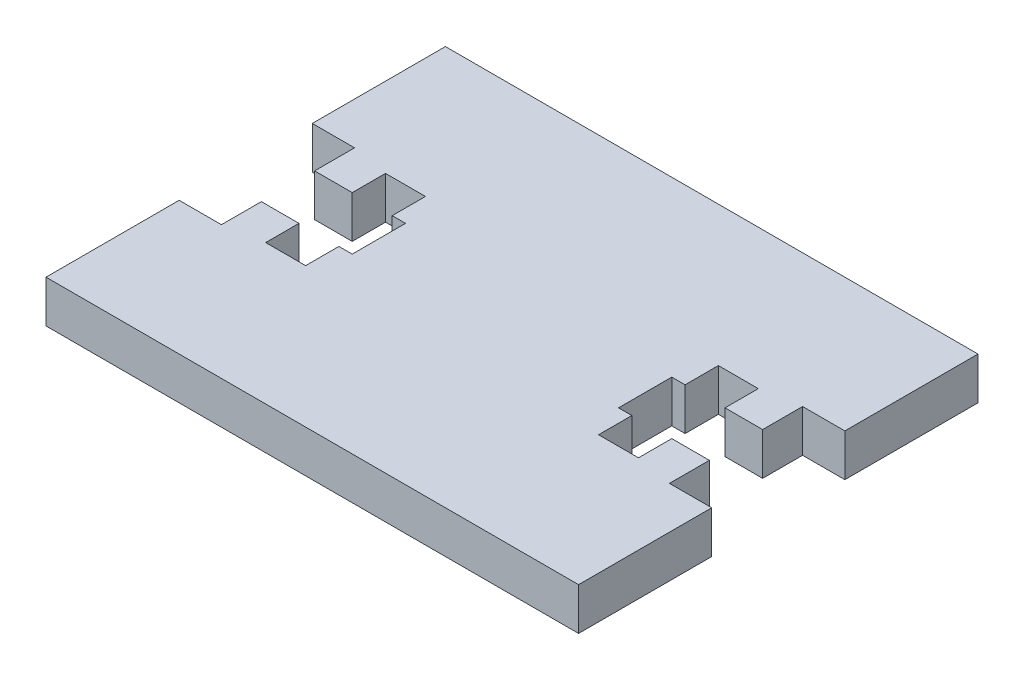
ISO-10303-21;
HEADER;
FILE_DESCRIPTION(('STEP AP214'),'2;1');
FILE_NAME('part.step','',(''),(''),'','','');
FILE_SCHEMA(('AUTOMOTIVE_DESIGN { 1 0 10303 214 1 1 1 1 }'));
ENDSEC;
DATA;
#1=APPLICATION_CONTEXT('core data for automotive mechanical design processes');
#2=APPLICATION_PROTOCOL_DEFINITION('international standard','automotive_design',2000,#1);
#3=PRODUCT_CONTEXT('',#1,'mechanical');
#4=PRODUCT('Part','Part','',(#3));
#5=PRODUCT_RELATED_PRODUCT_CATEGORY('part','',(#4));
#6=PRODUCT_DEFINITION_FORMATION('','',#4);
#7=PRODUCT_DEFINITION_CONTEXT('part definition',#1,'design');
#8=PRODUCT_DEFINITION('design','',#6,#7);
#9=PRODUCT_DEFINITION_SHAPE('','',#8);
#10=(LENGTH_UNIT() NAMED_UNIT(*) SI_UNIT(.MILLI.,.METRE.));
#11=(NAMED_UNIT(*) PLANE_ANGLE_UNIT() SI_UNIT($,.RADIAN.));
#12=(NAMED_UNIT(*) SI_UNIT($,.STERADIAN.) SOLID_ANGLE_UNIT());
#13=UNCERTAINTY_MEASURE_WITH_UNIT(LENGTH_MEASURE(1.E-05),#10,'distance_accuracy_value','');
#14=(GEOMETRIC_REPRESENTATION_CONTEXT(3) GLOBAL_UNCERTAINTY_ASSIGNED_CONTEXT((#13)) GLOBAL_UNIT_ASSIGNED_CONTEXT((#10,
#11,#12)) REPRESENTATION_CONTEXT('',''));
#15=CARTESIAN_POINT('',(0.,0.,0.));
#16=DIRECTION('',(0.,0.,1.));
#17=DIRECTION('',(1.,0.,0.));
#18=AXIS2_PLACEMENT_3D('',#15,#16,#17);
#19=CARTESIAN_POINT('',(0.,3.175,0.));
#20=DIRECTION('',(0.,0.,-1.));
#21=DIRECTION('',(-1.,0.,0.));
#22=AXIS2_PLACEMENT_3D('',#19,#20,#21);
#23=PLANE('',#22);
#24=DIRECTION('',(1.,0.,0.));
#25=VECTOR('',#24,1.);
#26=CARTESIAN_POINT('',(0.,0.,0.));
#27=LINE('',#26,#25);
#28=CARTESIAN_POINT('',(-20.,0.,0.));
#29=VERTEX_POINT('',#28);
#30=CARTESIAN_POINT('',(20.,0.,0.));
#31=VERTEX_POINT('',#30);
#32=EDGE_CURVE('E195',#29,#31,#27,.T.);
#33=ORIENTED_EDGE('',*,*,#32,.T.);
#34=DIRECTION('',(0.,-1.,0.));
#35=VECTOR('',#34,1.);
#36=CARTESIAN_POINT('',(20.,3.175,0.));
#37=LINE('',#36,#35);
#38=CARTESIAN_POINT('',(20.,3.175,0.));
#39=VERTEX_POINT('',#38);
#40=EDGE_CURVE('E11',#39,#31,#37,.T.);
#41=ORIENTED_EDGE('',*,*,#40,.F.);
#42=DIRECTION('',(1.,0.,0.));
#43=VECTOR('',#42,1.);
#44=CARTESIAN_POINT('',(0.,3.175,0.));
#45=LINE('',#44,#43);
#46=CARTESIAN_POINT('',(-20.,3.175,0.));
#47=VERTEX_POINT('',#46);
#48=EDGE_CURVE('E122',#47,#39,#45,.T.);
#49=ORIENTED_EDGE('',*,*,#48,.F.);
#50=DIRECTION('',(0.,-1.,0.));
#51=VECTOR('',#50,1.);
#52=CARTESIAN_POINT('',(-20.,3.175,0.));
#53=LINE('',#52,#51);
#54=EDGE_CURVE('E362',#47,#29,#53,.T.);
#55=ORIENTED_EDGE('',*,*,#54,.T.);
#56=EDGE_LOOP('',(#33,#41,#49,#55));
#57=FACE_BOUND('',#56,.T.);
#58=ADVANCED_FACE('F32',(#57),#23,.F.);
#59=CARTESIAN_POINT('',(20.,3.175,0.));
#60=DIRECTION('',(-1.,0.,0.));
#61=DIRECTION('',(0.,0.,1.));
#62=AXIS2_PLACEMENT_3D('',#59,#60,#61);
#63=PLANE('',#62);
#64=DIRECTION('',(0.,0.,-1.));
#65=VECTOR('',#64,1.);
#66=CARTESIAN_POINT('',(20.,0.,0.));
#67=LINE('',#66,#65);
#68=CARTESIAN_POINT('',(20.,0.,-10.));
#69=VERTEX_POINT('',#68);
#70=EDGE_CURVE('E197',#31,#69,#67,.T.);
#71=ORIENTED_EDGE('',*,*,#70,.T.);
#72=DIRECTION('',(0.,-1.,0.));
#73=VECTOR('',#72,1.);
#74=CARTESIAN_POINT('',(20.,3.175,-10.));
#75=LINE('',#74,#73);
#76=CARTESIAN_POINT('',(20.,3.175,-10.));
#77=VERTEX_POINT('',#76);
#78=EDGE_CURVE('E40',#77,#69,#75,.T.);
#79=ORIENTED_EDGE('',*,*,#78,.F.);
#80=DIRECTION('',(0.,0.,-1.));
#81=VECTOR('',#80,1.);
#82=CARTESIAN_POINT('',(20.,3.175,0.));
#83=LINE('',#82,#81);
#84=EDGE_CURVE('E357',#39,#77,#83,.T.);
#85=ORIENTED_EDGE('',*,*,#84,.F.);
#86=ORIENTED_EDGE('',*,*,#40,.T.);
#87=EDGE_LOOP('',(#71,#79,#85,#86));
#88=FACE_BOUND('',#87,.T.);
#89=ADVANCED_FACE('F358',(#88),#63,.F.);
#90=CARTESIAN_POINT('',(20.,3.175,-10.));
#91=DIRECTION('',(0.,0.,1.));
#92=DIRECTION('',(1.,0.,0.));
#93=AXIS2_PLACEMENT_3D('',#90,#91,#92);
#94=PLANE('',#93);
#95=DIRECTION('',(-1.,0.,0.));
#96=VECTOR('',#95,1.);
#97=CARTESIAN_POINT('',(20.,0.,-10.));
#98=LINE('',#97,#96);
#99=CARTESIAN_POINT('',(16.825,0.,-10.));
#100=VERTEX_POINT('',#99);
#101=EDGE_CURVE('E200',#69,#100,#98,.T.);
#102=ORIENTED_EDGE('',*,*,#101,.T.);
#103=DIRECTION('',(0.,-1.,0.));
#104=VECTOR('',#103,1.);
#105=CARTESIAN_POINT('',(16.825,3.175,-10.));
#106=LINE('',#105,#104);
#107=CARTESIAN_POINT('',(16.825,3.175,-10.));
#108=VERTEX_POINT('',#107);
#109=EDGE_CURVE('E268',#108,#100,#106,.T.);
#110=ORIENTED_EDGE('',*,*,#109,.F.);
#111=DIRECTION('',(-1.,0.,0.));
#112=VECTOR('',#111,1.);
#113=CARTESIAN_POINT('',(20.,3.175,-10.));
#114=LINE('',#113,#112);
#115=EDGE_CURVE('E277',#77,#108,#114,.T.);
#116=ORIENTED_EDGE('',*,*,#115,.F.);
#117=ORIENTED_EDGE('',*,*,#78,.T.);
#118=EDGE_LOOP('',(#102,#110,#116,#117));
#119=FACE_BOUND('',#118,.T.);
#120=ADVANCED_FACE('F275',(#119),#94,.F.);
#121=CARTESIAN_POINT('',(16.825,3.175,-10.));
#122=DIRECTION('',(-1.,0.,0.));
#123=DIRECTION('',(0.,0.,1.));
#124=AXIS2_PLACEMENT_3D('',#121,#122,#123);
#125=PLANE('',#124);
#126=DIRECTION('',(0.,0.,-1.));
#127=VECTOR('',#126,1.);
#128=CARTESIAN_POINT('',(16.825,0.,-10.));
#129=LINE('',#128,#127);
#130=CARTESIAN_POINT('',(16.825,0.,-13.));
#131=VERTEX_POINT('',#130);
#132=EDGE_CURVE('E202',#100,#131,#129,.T.);
#133=ORIENTED_EDGE('',*,*,#132,.T.);
#134=DIRECTION('',(0.,-1.,0.));
#135=VECTOR('',#134,1.);
#136=CARTESIAN_POINT('',(16.825,3.175,-13.));
#137=LINE('',#136,#135);
#138=CARTESIAN_POINT('',(16.825,3.175,-13.));
#139=VERTEX_POINT('',#138);
#140=EDGE_CURVE('E265',#139,#131,#137,.T.);
#141=ORIENTED_EDGE('',*,*,#140,.F.);
#142=DIRECTION('',(0.,0.,-1.));
#143=VECTOR('',#142,1.);
#144=CARTESIAN_POINT('',(16.825,3.175,-10.));
#145=LINE('',#144,#143);
#146=EDGE_CURVE('E298',#108,#139,#145,.T.);
#147=ORIENTED_EDGE('',*,*,#146,.F.);
#148=ORIENTED_EDGE('',*,*,#109,.T.);
#149=EDGE_LOOP('',(#133,#141,#147,#148));
#150=FACE_BOUND('',#149,.T.);
#151=ADVANCED_FACE('F289',(#150),#125,.F.);
#152=CARTESIAN_POINT('',(16.825,3.175,-13.));
#153=DIRECTION('',(0.,0.,1.));
#154=DIRECTION('',(1.,0.,0.));
#155=AXIS2_PLACEMENT_3D('',#152,#153,#154);
#156=PLANE('',#155);
#157=DIRECTION('',(-1.,0.,0.));
#158=VECTOR('',#157,1.);
#159=CARTESIAN_POINT('',(16.825,0.,-13.));
#160=LINE('',#159,#158);
#161=CARTESIAN_POINT('',(14.,0.,-13.));
#162=VERTEX_POINT('',#161);
#163=EDGE_CURVE('E204',#131,#162,#160,.T.);
#164=ORIENTED_EDGE('',*,*,#163,.T.);
#165=DIRECTION('',(0.,-1.,0.));
#166=VECTOR('',#165,1.);
#167=CARTESIAN_POINT('',(14.,3.175,-13.));
#168=LINE('',#167,#166);
#169=CARTESIAN_POINT('',(14.,3.175,-13.));
#170=VERTEX_POINT('',#169);
#171=EDGE_CURVE('E262',#170,#162,#168,.T.);
#172=ORIENTED_EDGE('',*,*,#171,.F.);
#173=DIRECTION('',(-1.,0.,0.));
#174=VECTOR('',#173,1.);
#175=CARTESIAN_POINT('',(16.825,3.175,-13.));
#176=LINE('',#175,#174);
#177=EDGE_CURVE('E295',#139,#170,#176,.T.);
#178=ORIENTED_EDGE('',*,*,#177,.F.);
#179=ORIENTED_EDGE('',*,*,#140,.T.);
#180=EDGE_LOOP('',(#164,#172,#178,#179));
#181=FACE_BOUND('',#180,.T.);
#182=ADVANCED_FACE('F293',(#181),#156,.F.);
#183=CARTESIAN_POINT('',(14.,3.175,-10.5));
#184=DIRECTION('',(1.,0.,0.));
#185=DIRECTION('',(0.,0.,-1.));
#186=AXIS2_PLACEMENT_3D('',#183,#184,#185);
#187=PLANE('',#186);
#188=DIRECTION('',(0.,0.,1.));
#189=VECTOR('',#188,1.);
#190=CARTESIAN_POINT('',(14.,0.,-10.5));
#191=LINE('',#190,#189);
#192=CARTESIAN_POINT('',(14.,0.,-10.5));
#193=VERTEX_POINT('',#192);
#194=EDGE_CURVE('E206',#162,#193,#191,.T.);
#195=ORIENTED_EDGE('',*,*,#194,.T.);
#196=DIRECTION('',(0.,-1.,0.));
#197=VECTOR('',#196,1.);
#198=CARTESIAN_POINT('',(14.,3.175,-10.5));
#199=LINE('',#198,#197);
#200=CARTESIAN_POINT('',(14.,3.175,-10.5));
#201=VERTEX_POINT('',#200);
#202=EDGE_CURVE('E259',#201,#193,#199,.T.);
#203=ORIENTED_EDGE('',*,*,#202,.F.);
#204=DIRECTION('',(0.,0.,1.));
#205=VECTOR('',#204,1.);
#206=CARTESIAN_POINT('',(14.,3.175,-10.5));
#207=LINE('',#206,#205);
#208=EDGE_CURVE('E297',#170,#201,#207,.T.);
#209=ORIENTED_EDGE('',*,*,#208,.F.);
#210=ORIENTED_EDGE('',*,*,#171,.T.);
#211=EDGE_LOOP('',(#195,#203,#209,#210));
#212=FACE_BOUND('',#211,.T.);
#213=ADVANCED_FACE('F665',(#212),#187,.F.);
#214=CARTESIAN_POINT('',(11.,3.175,-10.5));
#215=DIRECTION('',(0.,0.,1.));
#216=DIRECTION('',(1.,0.,0.));
#217=AXIS2_PLACEMENT_3D('',#214,#215,#216);
#218=PLANE('',#217);
#219=DIRECTION('',(-1.,0.,0.));
#220=VECTOR('',#219,1.);
#221=CARTESIAN_POINT('',(11.,0.,-10.5));
#222=LINE('',#221,#220);
#223=CARTESIAN_POINT('',(11.,0.,-10.5));
#224=VERTEX_POINT('',#223);
#225=EDGE_CURVE('E208',#193,#224,#222,.T.);
#226=ORIENTED_EDGE('',*,*,#225,.T.);
#227=DIRECTION('',(0.,-1.,0.));
#228=VECTOR('',#227,1.);
#229=CARTESIAN_POINT('',(11.,3.175,-10.5));
#230=LINE('',#229,#228);
#231=CARTESIAN_POINT('',(11.,3.175,-10.5));
#232=VERTEX_POINT('',#231);
#233=EDGE_CURVE('E256',#232,#224,#230,.T.);
#234=ORIENTED_EDGE('',*,*,#233,.F.);
#235=DIRECTION('',(-1.,0.,0.));
#236=VECTOR('',#235,1.);
#237=CARTESIAN_POINT('',(11.,3.175,-10.5));
#238=LINE('',#237,#236);
#239=EDGE_CURVE('E300',#201,#232,#238,.T.);
#240=ORIENTED_EDGE('',*,*,#239,.F.);
#241=ORIENTED_EDGE('',*,*,#202,.T.);
#242=EDGE_LOOP('',(#226,#234,#240,#241));
#243=FACE_BOUND('',#242,.T.);
#244=ADVANCED_FACE('F668',(#243),#218,.F.);
#245=CARTESIAN_POINT('',(11.,3.175,-10.5));
#246=DIRECTION('',(-1.,0.,0.));
#247=DIRECTION('',(0.,0.,1.));
#248=AXIS2_PLACEMENT_3D('',#245,#246,#247);
#249=PLANE('',#248);
#250=DIRECTION('',(0.,0.,-1.));
#251=VECTOR('',#250,1.);
#252=CARTESIAN_POINT('',(11.,0.,-10.5));
#253=LINE('',#252,#251);
#254=CARTESIAN_POINT('',(11.,0.,-13.));
#255=VERTEX_POINT('',#254);
#256=EDGE_CURVE('E210',#224,#255,#253,.T.);
#257=ORIENTED_EDGE('',*,*,#256,.T.);
#258=DIRECTION('',(0.,-1.,0.));
#259=VECTOR('',#258,1.);
#260=CARTESIAN_POINT('',(11.,3.175,-13.));
#261=LINE('',#260,#259);
#262=CARTESIAN_POINT('',(11.,3.175,-13.));
#263=VERTEX_POINT('',#262);
#264=EDGE_CURVE('E253',#263,#255,#261,.T.);
#265=ORIENTED_EDGE('',*,*,#264,.F.);
#266=DIRECTION('',(0.,0.,-1.));
#267=VECTOR('',#266,1.);
#268=CARTESIAN_POINT('',(11.,3.175,-10.5));
#269=LINE('',#268,#267);
#270=EDGE_CURVE('E306',#232,#263,#269,.T.);
#271=ORIENTED_EDGE('',*,*,#270,.F.);
#272=ORIENTED_EDGE('',*,*,#233,.T.);
#273=EDGE_LOOP('',(#257,#265,#271,#272));
#274=FACE_BOUND('',#273,.T.);
#275=ADVANCED_FACE('F672',(#274),#249,.F.);
#276=CARTESIAN_POINT('',(10.,3.175,-13.));
#277=DIRECTION('',(0.,0.,1.));
#278=DIRECTION('',(1.,0.,0.));
#279=AXIS2_PLACEMENT_3D('',#276,#277,#278);
#280=PLANE('',#279);
#281=DIRECTION('',(-1.,0.,0.));
#282=VECTOR('',#281,1.);
#283=CARTESIAN_POINT('',(10.,0.,-13.));
#284=LINE('',#283,#282);
#285=CARTESIAN_POINT('',(10.,0.,-13.));
#286=VERTEX_POINT('',#285);
#287=EDGE_CURVE('E212',#255,#286,#284,.T.);
#288=ORIENTED_EDGE('',*,*,#287,.T.);
#289=DIRECTION('',(0.,-1.,0.));
#290=VECTOR('',#289,1.);
#291=CARTESIAN_POINT('',(10.,3.175,-13.));
#292=LINE('',#291,#290);
#293=CARTESIAN_POINT('',(10.,3.175,-13.));
#294=VERTEX_POINT('',#293);
#295=EDGE_CURVE('E250',#294,#286,#292,.T.);
#296=ORIENTED_EDGE('',*,*,#295,.F.);
#297=DIRECTION('',(-1.,0.,0.));
#298=VECTOR('',#297,1.);
#299=CARTESIAN_POINT('',(10.,3.175,-13.));
#300=LINE('',#299,#298);
#301=EDGE_CURVE('E308',#263,#294,#300,.T.);
#302=ORIENTED_EDGE('',*,*,#301,.F.);
#303=ORIENTED_EDGE('',*,*,#264,.T.);
#304=EDGE_LOOP('',(#288,#296,#302,#303));
#305=FACE_BOUND('',#304,.T.);
#306=ADVANCED_FACE('F676',(#305),#280,.F.);
#307=CARTESIAN_POINT('',(10.,3.175,-13.));
#308=DIRECTION('',(-1.,0.,0.));
#309=DIRECTION('',(0.,0.,1.));
#310=AXIS2_PLACEMENT_3D('',#307,#308,#309);
#311=PLANE('',#310);
#312=DIRECTION('',(0.,0.,-1.));
#313=VECTOR('',#312,1.);
#314=CARTESIAN_POINT('',(10.,0.,-13.));
#315=LINE('',#314,#313);
#316=CARTESIAN_POINT('',(10.,0.,-17.));
#317=VERTEX_POINT('',#316);
#318=EDGE_CURVE('E214',#286,#317,#315,.T.);
#319=ORIENTED_EDGE('',*,*,#318,.T.);
#320=DIRECTION('',(0.,-1.,0.));
#321=VECTOR('',#320,1.);
#322=CARTESIAN_POINT('',(10.,3.175,-17.));
#323=LINE('',#322,#321);
#324=CARTESIAN_POINT('',(10.,3.175,-17.));
#325=VERTEX_POINT('',#324);
#326=EDGE_CURVE('E247',#325,#317,#323,.T.);
#327=ORIENTED_EDGE('',*,*,#326,.F.);
#328=DIRECTION('',(0.,0.,-1.));
#329=VECTOR('',#328,1.);
#330=CARTESIAN_POINT('',(10.,3.175,-13.));
#331=LINE('',#330,#329);
#332=EDGE_CURVE('E310',#294,#325,#331,.T.);
#333=ORIENTED_EDGE('',*,*,#332,.F.);
#334=ORIENTED_EDGE('',*,*,#295,.T.);
#335=EDGE_LOOP('',(#319,#327,#333,#334));
#336=FACE_BOUND('',#335,.T.);
#337=ADVANCED_FACE('F680',(#336),#311,.F.);
#338=CARTESIAN_POINT('',(11.,3.175,-17.));
#339=DIRECTION('',(0.,0.,-1.));
#340=DIRECTION('',(-1.,0.,0.));
#341=AXIS2_PLACEMENT_3D('',#338,#339,#340);
#342=PLANE('',#341);
#343=DIRECTION('',(1.,0.,0.));
#344=VECTOR('',#343,1.);
#345=CARTESIAN_POINT('',(11.,0.,-17.));
#346=LINE('',#345,#344);
#347=CARTESIAN_POINT('',(11.,0.,-17.));
#348=VERTEX_POINT('',#347);
#349=EDGE_CURVE('E216',#317,#348,#346,.T.);
#350=ORIENTED_EDGE('',*,*,#349,.T.);
#351=DIRECTION('',(0.,-1.,0.));
#352=VECTOR('',#351,1.);
#353=CARTESIAN_POINT('',(11.,3.175,-17.));
#354=LINE('',#353,#352);
#355=CARTESIAN_POINT('',(11.,3.175,-17.));
#356=VERTEX_POINT('',#355);
#357=EDGE_CURVE('E244',#356,#348,#354,.T.);
#358=ORIENTED_EDGE('',*,*,#357,.F.);
#359=DIRECTION('',(1.,0.,0.));
#360=VECTOR('',#359,1.);
#361=CARTESIAN_POINT('',(11.,3.175,-17.));
#362=LINE('',#361,#360);
#363=EDGE_CURVE('E312',#325,#356,#362,.T.);
#364=ORIENTED_EDGE('',*,*,#363,.F.);
#365=ORIENTED_EDGE('',*,*,#326,.T.);
#366=EDGE_LOOP('',(#350,#358,#364,#365));
#367=FACE_BOUND('',#366,.T.);
#368=ADVANCED_FACE('F684',(#367),#342,.F.);
#369=CARTESIAN_POINT('',(11.,3.175,-17.));
#370=DIRECTION('',(-1.,0.,0.));
#371=DIRECTION('',(0.,0.,1.));
#372=AXIS2_PLACEMENT_3D('',#369,#370,#371);
#373=PLANE('',#372);
#374=DIRECTION('',(0.,0.,-1.));
#375=VECTOR('',#374,1.);
#376=CARTESIAN_POINT('',(11.,0.,-17.));
#377=LINE('',#376,#375);
#378=CARTESIAN_POINT('',(11.,0.,-19.5));
#379=VERTEX_POINT('',#378);
#380=EDGE_CURVE('E218',#348,#379,#377,.T.);
#381=ORIENTED_EDGE('',*,*,#380,.T.);
#382=DIRECTION('',(0.,-1.,0.));
#383=VECTOR('',#382,1.);
#384=CARTESIAN_POINT('',(11.,3.175,-19.5));
#385=LINE('',#384,#383);
#386=CARTESIAN_POINT('',(11.,3.175,-19.5));
#387=VERTEX_POINT('',#386);
#388=EDGE_CURVE('E241',#387,#379,#385,.T.);
#389=ORIENTED_EDGE('',*,*,#388,.F.);
#390=DIRECTION('',(0.,0.,-1.));
#391=VECTOR('',#390,1.);
#392=CARTESIAN_POINT('',(11.,3.175,-17.));
#393=LINE('',#392,#391);
#394=EDGE_CURVE('E314',#356,#387,#393,.T.);
#395=ORIENTED_EDGE('',*,*,#394,.F.);
#396=ORIENTED_EDGE('',*,*,#357,.T.);
#397=EDGE_LOOP('',(#381,#389,#395,#396));
#398=FACE_BOUND('',#397,.T.);
#399=ADVANCED_FACE('F688',(#398),#373,.F.);
#400=CARTESIAN_POINT('',(11.,3.175,-19.5));
#401=DIRECTION('',(0.,0.,-1.));
#402=DIRECTION('',(-1.,0.,0.));
#403=AXIS2_PLACEMENT_3D('',#400,#401,#402);
#404=PLANE('',#403);
#405=DIRECTION('',(1.,0.,0.));
#406=VECTOR('',#405,1.);
#407=CARTESIAN_POINT('',(11.,0.,-19.5));
#408=LINE('',#407,#406);
#409=CARTESIAN_POINT('',(14.,0.,-19.5));
#410=VERTEX_POINT('',#409);
#411=EDGE_CURVE('E220',#379,#410,#408,.T.);
#412=ORIENTED_EDGE('',*,*,#411,.T.);
#413=DIRECTION('',(0.,-1.,0.));
#414=VECTOR('',#413,1.);
#415=CARTESIAN_POINT('',(14.,3.175,-19.5));
#416=LINE('',#415,#414);
#417=CARTESIAN_POINT('',(14.,3.175,-19.5));
#418=VERTEX_POINT('',#417);
#419=EDGE_CURVE('E238',#418,#410,#416,.T.);
#420=ORIENTED_EDGE('',*,*,#419,.F.);
#421=DIRECTION('',(1.,0.,0.));
#422=VECTOR('',#421,1.);
#423=CARTESIAN_POINT('',(11.,3.175,-19.5));
#424=LINE('',#423,#422);
#425=EDGE_CURVE('E316',#387,#418,#424,.T.);
#426=ORIENTED_EDGE('',*,*,#425,.F.);
#427=ORIENTED_EDGE('',*,*,#388,.T.);
#428=EDGE_LOOP('',(#412,#420,#426,#427));
#429=FACE_BOUND('',#428,.T.);
#430=ADVANCED_FACE('F692',(#429),#404,.F.);
#431=CARTESIAN_POINT('',(14.,3.175,-17.));
#432=DIRECTION('',(1.,0.,0.));
#433=DIRECTION('',(0.,0.,-1.));
#434=AXIS2_PLACEMENT_3D('',#431,#432,#433);
#435=PLANE('',#434);
#436=DIRECTION('',(0.,0.,1.));
#437=VECTOR('',#436,1.);
#438=CARTESIAN_POINT('',(14.,0.,-17.));
#439=LINE('',#438,#437);
#440=CARTESIAN_POINT('',(14.,0.,-17.));
#441=VERTEX_POINT('',#440);
#442=EDGE_CURVE('E222',#410,#441,#439,.T.);
#443=ORIENTED_EDGE('',*,*,#442,.T.);
#444=DIRECTION('',(0.,-1.,0.));
#445=VECTOR('',#444,1.);
#446=CARTESIAN_POINT('',(14.,3.175,-17.));
#447=LINE('',#446,#445);
#448=CARTESIAN_POINT('',(14.,3.175,-17.));
#449=VERTEX_POINT('',#448);
#450=EDGE_CURVE('E235',#449,#441,#447,.T.);
#451=ORIENTED_EDGE('',*,*,#450,.F.);
#452=DIRECTION('',(0.,0.,1.));
#453=VECTOR('',#452,1.);
#454=CARTESIAN_POINT('',(14.,3.175,-17.));
#455=LINE('',#454,#453);
#456=EDGE_CURVE('E318',#418,#449,#455,.T.);
#457=ORIENTED_EDGE('',*,*,#456,.F.);
#458=ORIENTED_EDGE('',*,*,#419,.T.);
#459=EDGE_LOOP('',(#443,#451,#457,#458));
#460=FACE_BOUND('',#459,.T.);
#461=ADVANCED_FACE('F324',(#460),#435,.F.);
#462=CARTESIAN_POINT('',(16.825,3.175,-17.));
#463=DIRECTION('',(0.,0.,-1.));
#464=DIRECTION('',(-1.,0.,0.));
#465=AXIS2_PLACEMENT_3D('',#462,#463,#464);
#466=PLANE('',#465);
#467=DIRECTION('',(1.,0.,0.));
#468=VECTOR('',#467,1.);
#469=CARTESIAN_POINT('',(16.825,0.,-17.));
#470=LINE('',#469,#468);
#471=CARTESIAN_POINT('',(16.825,0.,-17.));
#472=VERTEX_POINT('',#471);
#473=EDGE_CURVE('E224',#441,#472,#470,.T.);
#474=ORIENTED_EDGE('',*,*,#473,.T.);
#475=DIRECTION('',(0.,-1.,0.));
#476=VECTOR('',#475,1.);
#477=CARTESIAN_POINT('',(16.825,3.175,-17.));
#478=LINE('',#477,#476);
#479=CARTESIAN_POINT('',(16.825,3.175,-17.));
#480=VERTEX_POINT('',#479);
#481=EDGE_CURVE('E184',#480,#472,#478,.T.);
#482=ORIENTED_EDGE('',*,*,#481,.F.);
#483=DIRECTION('',(1.,0.,0.));
#484=VECTOR('',#483,1.);
#485=CARTESIAN_POINT('',(16.825,3.175,-17.));
#486=LINE('',#485,#484);
#487=EDGE_CURVE('E175',#449,#480,#486,.T.);
#488=ORIENTED_EDGE('',*,*,#487,.F.);
#489=ORIENTED_EDGE('',*,*,#450,.T.);
#490=EDGE_LOOP('',(#474,#482,#488,#489));
#491=FACE_BOUND('',#490,.T.);
#492=ADVANCED_FACE('F328',(#491),#466,.F.);
#493=CARTESIAN_POINT('',(16.825,3.175,-17.));
#494=DIRECTION('',(-1.,0.,0.));
#495=DIRECTION('',(0.,0.,1.));
#496=AXIS2_PLACEMENT_3D('',#493,#494,#495);
#497=PLANE('',#496);
#498=DIRECTION('',(0.,0.,-1.));
#499=VECTOR('',#498,1.);
#500=CARTESIAN_POINT('',(16.825,0.,-17.));
#501=LINE('',#500,#499);
#502=CARTESIAN_POINT('',(16.825,0.,-20.));
#503=VERTEX_POINT('',#502);
#504=EDGE_CURVE('E183',#472,#503,#501,.T.);
#505=ORIENTED_EDGE('',*,*,#504,.T.);
#506=DIRECTION('',(0.,-1.,0.));
#507=VECTOR('',#506,1.);
#508=CARTESIAN_POINT('',(16.825,3.175,-20.));
#509=LINE('',#508,#507);
#510=CARTESIAN_POINT('',(16.825,3.175,-20.));
#511=VERTEX_POINT('',#510);
#512=EDGE_CURVE('E180',#511,#503,#509,.T.);
#513=ORIENTED_EDGE('',*,*,#512,.F.);
#514=DIRECTION('',(0.,0.,-1.));
#515=VECTOR('',#514,1.);
#516=CARTESIAN_POINT('',(16.825,3.175,-17.));
#517=LINE('',#516,#515);
#518=EDGE_CURVE('E169',#480,#511,#517,.T.);
#519=ORIENTED_EDGE('',*,*,#518,.F.);
#520=ORIENTED_EDGE('',*,*,#481,.T.);
#521=EDGE_LOOP('',(#505,#513,#519,#520));
#522=FACE_BOUND('',#521,.T.);
#523=ADVANCED_FACE('F181',(#522),#497,.F.);
#524=CARTESIAN_POINT('',(20.,3.175,-20.));
#525=DIRECTION('',(0.,0.,-1.));
#526=DIRECTION('',(-1.,0.,0.));
#527=AXIS2_PLACEMENT_3D('',#524,#525,#526);
#528=PLANE('',#527);
#529=DIRECTION('',(1.,0.,0.));
#530=VECTOR('',#529,1.);
#531=CARTESIAN_POINT('',(20.,0.,-20.));
#532=LINE('',#531,#530);
#533=CARTESIAN_POINT('',(20.,0.,-20.));
#534=VERTEX_POINT('',#533);
#535=EDGE_CURVE('E108',#503,#534,#532,.T.);
#536=ORIENTED_EDGE('',*,*,#535,.T.);
#537=DIRECTION('',(0.,-1.,0.));
#538=VECTOR('',#537,1.);
#539=CARTESIAN_POINT('',(20.,3.175,-20.));
#540=LINE('',#539,#538);
#541=CARTESIAN_POINT('',(20.,3.175,-20.));
#542=VERTEX_POINT('',#541);
#543=EDGE_CURVE('E185',#542,#534,#540,.T.);
#544=ORIENTED_EDGE('',*,*,#543,.F.);
#545=DIRECTION('',(1.,0.,0.));
#546=VECTOR('',#545,1.);
#547=CARTESIAN_POINT('',(20.,3.175,-20.));
#548=LINE('',#547,#546);
#549=EDGE_CURVE('E173',#511,#542,#548,.T.);
#550=ORIENTED_EDGE('',*,*,#549,.F.);
#551=ORIENTED_EDGE('',*,*,#512,.T.);
#552=EDGE_LOOP('',(#536,#544,#550,#551));
#553=FACE_BOUND('',#552,.T.);
#554=ADVANCED_FACE('F187',(#553),#528,.F.);
#555=CARTESIAN_POINT('',(20.,3.175,-20.));
#556=DIRECTION('',(-1.,0.,0.));
#557=DIRECTION('',(0.,0.,1.));
#558=AXIS2_PLACEMENT_3D('',#555,#556,#557);
#559=PLANE('',#558);
#560=DIRECTION('',(0.,0.,-1.));
#561=VECTOR('',#560,1.);
#562=CARTESIAN_POINT('',(20.,0.,-20.));
#563=LINE('',#562,#561);
#564=CARTESIAN_POINT('',(20.,0.,-30.));
#565=VERTEX_POINT('',#564);
#566=EDGE_CURVE('E114',#534,#565,#563,.T.);
#567=ORIENTED_EDGE('',*,*,#566,.T.);
#568=DIRECTION('',(0.,-1.,0.));
#569=VECTOR('',#568,1.);
#570=CARTESIAN_POINT('',(20.,3.175,-30.));
#571=LINE('',#570,#569);
#572=CARTESIAN_POINT('',(20.,3.175,-30.));
#573=VERTEX_POINT('',#572);
#574=EDGE_CURVE('E194',#573,#565,#571,.T.);
#575=ORIENTED_EDGE('',*,*,#574,.F.);
#576=DIRECTION('',(0.,0.,-1.));
#577=VECTOR('',#576,1.);
#578=CARTESIAN_POINT('',(20.,3.175,-20.));
#579=LINE('',#578,#577);
#580=EDGE_CURVE('E48',#542,#573,#579,.T.);
#581=ORIENTED_EDGE('',*,*,#580,.F.);
#582=ORIENTED_EDGE('',*,*,#543,.T.);
#583=EDGE_LOOP('',(#567,#575,#581,#582));
#584=FACE_BOUND('',#583,.T.);
#585=ADVANCED_FACE('F705',(#584),#559,.F.);
#586=CARTESIAN_POINT('',(0.,3.175,-30.));
#587=DIRECTION('',(0.,0.,1.));
#588=DIRECTION('',(1.,0.,0.));
#589=AXIS2_PLACEMENT_3D('',#586,#587,#588);
#590=PLANE('',#589);
#591=DIRECTION('',(-1.,0.,0.));
#592=VECTOR('',#591,1.);
#593=CARTESIAN_POINT('',(0.,0.,-30.));
#594=LINE('',#593,#592);
#595=CARTESIAN_POINT('',(-20.,0.,-30.));
#596=VERTEX_POINT('',#595);
#597=EDGE_CURVE('E229',#565,#596,#594,.T.);
#598=ORIENTED_EDGE('',*,*,#597,.T.);
#599=DIRECTION('',(0.,-1.,0.));
#600=VECTOR('',#599,1.);
#601=CARTESIAN_POINT('',(-20.,3.175,-30.));
#602=LINE('',#601,#600);
#603=CARTESIAN_POINT('',(-20.,3.175,-30.));
#604=VERTEX_POINT('',#603);
#605=EDGE_CURVE('E198',#604,#596,#602,.T.);
#606=ORIENTED_EDGE('',*,*,#605,.F.);
#607=DIRECTION('',(-1.,0.,0.));
#608=VECTOR('',#607,1.);
#609=CARTESIAN_POINT('',(0.,3.175,-30.));
#610=LINE('',#609,#608);
#611=EDGE_CURVE('E189',#573,#604,#610,.T.);
#612=ORIENTED_EDGE('',*,*,#611,.F.);
#613=ORIENTED_EDGE('',*,*,#574,.T.);
#614=EDGE_LOOP('',(#598,#606,#612,#613));
#615=FACE_BOUND('',#614,.T.);
#616=ADVANCED_FACE('F338',(#615),#590,.F.);
#617=CARTESIAN_POINT('',(0.,3.175,0.));
#618=DIRECTION('',(0.,-1.,0.));
#619=DIRECTION('',(0.,0.,-1.));
#620=AXIS2_PLACEMENT_3D('',#617,#618,#619);
#621=PLANE('',#620);
#622=ORIENTED_EDGE('',*,*,#611,.T.);
#623=DIRECTION('',(0.,0.,-1.));
#624=VECTOR('',#623,1.);
#625=CARTESIAN_POINT('',(-20.,3.175,-20.));
#626=LINE('',#625,#624);
#627=CARTESIAN_POINT('',(-20.,3.175,-20.));
#628=VERTEX_POINT('',#627);
#629=EDGE_CURVE('E348',#628,#604,#626,.T.);
#630=ORIENTED_EDGE('',*,*,#629,.F.);
#631=DIRECTION('',(-1.,0.,0.));
#632=VECTOR('',#631,1.);
#633=CARTESIAN_POINT('',(-20.,3.175,-20.));
#634=LINE('',#633,#632);
#635=CARTESIAN_POINT('',(-16.825,3.175,-20.));
#636=VERTEX_POINT('',#635);
#637=EDGE_CURVE('E470',#636,#628,#634,.T.);
#638=ORIENTED_EDGE('',*,*,#637,.F.);
#639=DIRECTION('',(0.,0.,-1.));
#640=VECTOR('',#639,1.);
#641=CARTESIAN_POINT('',(-16.825,3.175,-17.));
#642=LINE('',#641,#640);
#643=CARTESIAN_POINT('',(-16.825,3.175,-17.));
#644=VERTEX_POINT('',#643);
#645=EDGE_CURVE('E474',#644,#636,#642,.T.);
#646=ORIENTED_EDGE('',*,*,#645,.F.);
#647=DIRECTION('',(-1.,0.,0.));
#648=VECTOR('',#647,1.);
#649=CARTESIAN_POINT('',(-16.825,3.175,-17.));
#650=LINE('',#649,#648);
#651=CARTESIAN_POINT('',(-14.,3.175,-17.));
#652=VERTEX_POINT('',#651);
#653=EDGE_CURVE('E476',#652,#644,#650,.T.);
#654=ORIENTED_EDGE('',*,*,#653,.F.);
#655=DIRECTION('',(0.,0.,1.));
#656=VECTOR('',#655,1.);
#657=CARTESIAN_POINT('',(-14.,3.175,-17.));
#658=LINE('',#657,#656);
#659=CARTESIAN_POINT('',(-14.,3.175,-19.5));
#660=VERTEX_POINT('',#659);
#661=EDGE_CURVE('E481',#660,#652,#658,.T.);
#662=ORIENTED_EDGE('',*,*,#661,.F.);
#663=DIRECTION('',(-1.,0.,0.));
#664=VECTOR('',#663,1.);
#665=CARTESIAN_POINT('',(-11.,3.175,-19.5));
#666=LINE('',#665,#664);
#667=CARTESIAN_POINT('',(-11.,3.175,-19.5));
#668=VERTEX_POINT('',#667);
#669=EDGE_CURVE('E484',#668,#660,#666,.T.);
#670=ORIENTED_EDGE('',*,*,#669,.F.);
#671=DIRECTION('',(0.,0.,-1.));
#672=VECTOR('',#671,1.);
#673=CARTESIAN_POINT('',(-11.,3.175,-17.));
#674=LINE('',#673,#672);
#675=CARTESIAN_POINT('',(-11.,3.175,-17.));
#676=VERTEX_POINT('',#675);
#677=EDGE_CURVE('E487',#676,#668,#674,.T.);
#678=ORIENTED_EDGE('',*,*,#677,.F.);
#679=DIRECTION('',(-1.,0.,0.));
#680=VECTOR('',#679,1.);
#681=CARTESIAN_POINT('',(-11.,3.175,-17.));
#682=LINE('',#681,#680);
#683=CARTESIAN_POINT('',(-10.,3.175,-17.));
#684=VERTEX_POINT('',#683);
#685=EDGE_CURVE('E490',#684,#676,#682,.T.);
#686=ORIENTED_EDGE('',*,*,#685,.F.);
#687=DIRECTION('',(0.,0.,-1.));
#688=VECTOR('',#687,1.);
#689=CARTESIAN_POINT('',(-10.,3.175,-13.));
#690=LINE('',#689,#688);
#691=CARTESIAN_POINT('',(-10.,3.175,-13.));
#692=VERTEX_POINT('',#691);
#693=EDGE_CURVE('E493',#692,#684,#690,.T.);
#694=ORIENTED_EDGE('',*,*,#693,.F.);
#695=DIRECTION('',(1.,0.,0.));
#696=VECTOR('',#695,1.);
#697=CARTESIAN_POINT('',(-10.,3.175,-13.));
#698=LINE('',#697,#696);
#699=CARTESIAN_POINT('',(-11.,3.175,-13.));
#700=VERTEX_POINT('',#699);
#701=EDGE_CURVE('E496',#700,#692,#698,.T.);
#702=ORIENTED_EDGE('',*,*,#701,.F.);
#703=DIRECTION('',(0.,0.,-1.));
#704=VECTOR('',#703,1.);
#705=CARTESIAN_POINT('',(-11.,3.175,-10.5));
#706=LINE('',#705,#704);
#707=CARTESIAN_POINT('',(-11.,3.175,-10.5));
#708=VERTEX_POINT('',#707);
#709=EDGE_CURVE('E499',#708,#700,#706,.T.);
#710=ORIENTED_EDGE('',*,*,#709,.F.);
#711=DIRECTION('',(1.,0.,0.));
#712=VECTOR('',#711,1.);
#713=CARTESIAN_POINT('',(-11.,3.175,-10.5));
#714=LINE('',#713,#712);
#715=CARTESIAN_POINT('',(-14.,3.175,-10.5));
#716=VERTEX_POINT('',#715);
#717=EDGE_CURVE('E502',#716,#708,#714,.T.);
#718=ORIENTED_EDGE('',*,*,#717,.F.);
#719=DIRECTION('',(0.,0.,1.));
#720=VECTOR('',#719,1.);
#721=CARTESIAN_POINT('',(-14.,3.175,-10.5));
#722=LINE('',#721,#720);
#723=CARTESIAN_POINT('',(-14.,3.175,-13.));
#724=VERTEX_POINT('',#723);
#725=EDGE_CURVE('E505',#724,#716,#722,.T.);
#726=ORIENTED_EDGE('',*,*,#725,.F.);
#727=DIRECTION('',(1.,0.,0.));
#728=VECTOR('',#727,1.);
#729=CARTESIAN_POINT('',(-16.825,3.175,-13.));
#730=LINE('',#729,#728);
#731=CARTESIAN_POINT('',(-16.825,3.175,-13.));
#732=VERTEX_POINT('',#731);
#733=EDGE_CURVE('E508',#732,#724,#730,.T.);
#734=ORIENTED_EDGE('',*,*,#733,.F.);
#735=DIRECTION('',(0.,0.,-1.));
#736=VECTOR('',#735,1.);
#737=CARTESIAN_POINT('',(-16.825,3.175,-10.));
#738=LINE('',#737,#736);
#739=CARTESIAN_POINT('',(-16.825,3.175,-10.));
#740=VERTEX_POINT('',#739);
#741=EDGE_CURVE('E511',#740,#732,#738,.T.);
#742=ORIENTED_EDGE('',*,*,#741,.F.);
#743=DIRECTION('',(1.,0.,0.));
#744=VECTOR('',#743,1.);
#745=CARTESIAN_POINT('',(-20.,3.175,-10.));
#746=LINE('',#745,#744);
#747=CARTESIAN_POINT('',(-20.,3.175,-10.));
#748=VERTEX_POINT('',#747);
#749=EDGE_CURVE('E514',#748,#740,#746,.T.);
#750=ORIENTED_EDGE('',*,*,#749,.F.);
#751=DIRECTION('',(0.,0.,-1.));
#752=VECTOR('',#751,1.);
#753=CARTESIAN_POINT('',(-20.,3.175,0.));
#754=LINE('',#753,#752);
#755=EDGE_CURVE('E517',#47,#748,#754,.T.);
#756=ORIENTED_EDGE('',*,*,#755,.F.);
#757=ORIENTED_EDGE('',*,*,#48,.T.);
#758=ORIENTED_EDGE('',*,*,#84,.T.);
#759=ORIENTED_EDGE('',*,*,#115,.T.);
#760=ORIENTED_EDGE('',*,*,#146,.T.);
#761=ORIENTED_EDGE('',*,*,#177,.T.);
#762=ORIENTED_EDGE('',*,*,#208,.T.);
#763=ORIENTED_EDGE('',*,*,#239,.T.);
#764=ORIENTED_EDGE('',*,*,#270,.T.);
#765=ORIENTED_EDGE('',*,*,#301,.T.);
#766=ORIENTED_EDGE('',*,*,#332,.T.);
#767=ORIENTED_EDGE('',*,*,#363,.T.);
#768=ORIENTED_EDGE('',*,*,#394,.T.);
#769=ORIENTED_EDGE('',*,*,#425,.T.);
#770=ORIENTED_EDGE('',*,*,#456,.T.);
#771=ORIENTED_EDGE('',*,*,#487,.T.);
#772=ORIENTED_EDGE('',*,*,#518,.T.);
#773=ORIENTED_EDGE('',*,*,#549,.T.);
#774=ORIENTED_EDGE('',*,*,#580,.T.);
#775=EDGE_LOOP('',(#622,#630,#638,#646,#654,#662,#670,#678,#686,#694,#702,#710,#718,#726,#734,
#742,#750,#756,#757,#758,#759,#760,#761,#762,#763,#764,#765,#766,#767,#768,#769,#770,#771,#772,
#773,#774));
#776=FACE_BOUND('',#775,.T.);
#777=ADVANCED_FACE('F171',(#776),#621,.F.);
#778=CARTESIAN_POINT('',(0.,0.,0.));
#779=DIRECTION('',(0.,-1.,0.));
#780=DIRECTION('',(0.,0.,-1.));
#781=AXIS2_PLACEMENT_3D('',#778,#779,#780);
#782=PLANE('',#781);
#783=ORIENTED_EDGE('',*,*,#32,.F.);
#784=DIRECTION('',(0.,0.,-1.));
#785=VECTOR('',#784,1.);
#786=CARTESIAN_POINT('',(-20.,0.,0.));
#787=LINE('',#786,#785);
#788=CARTESIAN_POINT('',(-20.,0.,-10.));
#789=VERTEX_POINT('',#788);
#790=EDGE_CURVE('E367',#29,#789,#787,.T.);
#791=ORIENTED_EDGE('',*,*,#790,.T.);
#792=DIRECTION('',(1.,0.,0.));
#793=VECTOR('',#792,1.);
#794=CARTESIAN_POINT('',(-20.,0.,-10.));
#795=LINE('',#794,#793);
#796=CARTESIAN_POINT('',(-16.825,0.,-10.));
#797=VERTEX_POINT('',#796);
#798=EDGE_CURVE('E561',#789,#797,#795,.T.);
#799=ORIENTED_EDGE('',*,*,#798,.T.);
#800=DIRECTION('',(0.,0.,-1.));
#801=VECTOR('',#800,1.);
#802=CARTESIAN_POINT('',(-16.825,0.,-10.));
#803=LINE('',#802,#801);
#804=CARTESIAN_POINT('',(-16.825,0.,-13.));
#805=VERTEX_POINT('',#804);
#806=EDGE_CURVE('E558',#797,#805,#803,.T.);
#807=ORIENTED_EDGE('',*,*,#806,.T.);
#808=DIRECTION('',(1.,0.,0.));
#809=VECTOR('',#808,1.);
#810=CARTESIAN_POINT('',(-16.825,0.,-13.));
#811=LINE('',#810,#809);
#812=CARTESIAN_POINT('',(-14.,0.,-13.));
#813=VERTEX_POINT('',#812);
#814=EDGE_CURVE('E555',#805,#813,#811,.T.);
#815=ORIENTED_EDGE('',*,*,#814,.T.);
#816=DIRECTION('',(0.,0.,1.));
#817=VECTOR('',#816,1.);
#818=CARTESIAN_POINT('',(-14.,0.,-10.5));
#819=LINE('',#818,#817);
#820=CARTESIAN_POINT('',(-14.,0.,-10.5));
#821=VERTEX_POINT('',#820);
#822=EDGE_CURVE('E552',#813,#821,#819,.T.);
#823=ORIENTED_EDGE('',*,*,#822,.T.);
#824=DIRECTION('',(1.,0.,0.));
#825=VECTOR('',#824,1.);
#826=CARTESIAN_POINT('',(-11.,0.,-10.5));
#827=LINE('',#826,#825);
#828=CARTESIAN_POINT('',(-11.,0.,-10.5));
#829=VERTEX_POINT('',#828);
#830=EDGE_CURVE('E549',#821,#829,#827,.T.);
#831=ORIENTED_EDGE('',*,*,#830,.T.);
#832=DIRECTION('',(0.,0.,-1.));
#833=VECTOR('',#832,1.);
#834=CARTESIAN_POINT('',(-11.,0.,-10.5));
#835=LINE('',#834,#833);
#836=CARTESIAN_POINT('',(-11.,0.,-13.));
#837=VERTEX_POINT('',#836);
#838=EDGE_CURVE('E546',#829,#837,#835,.T.);
#839=ORIENTED_EDGE('',*,*,#838,.T.);
#840=DIRECTION('',(1.,0.,0.));
#841=VECTOR('',#840,1.);
#842=CARTESIAN_POINT('',(-10.,0.,-13.));
#843=LINE('',#842,#841);
#844=CARTESIAN_POINT('',(-10.,0.,-13.));
#845=VERTEX_POINT('',#844);
#846=EDGE_CURVE('E543',#837,#845,#843,.T.);
#847=ORIENTED_EDGE('',*,*,#846,.T.);
#848=DIRECTION('',(0.,0.,-1.));
#849=VECTOR('',#848,1.);
#850=CARTESIAN_POINT('',(-10.,0.,-13.));
#851=LINE('',#850,#849);
#852=CARTESIAN_POINT('',(-10.,0.,-17.));
#853=VERTEX_POINT('',#852);
#854=EDGE_CURVE('E540',#845,#853,#851,.T.);
#855=ORIENTED_EDGE('',*,*,#854,.T.);
#856=DIRECTION('',(-1.,0.,0.));
#857=VECTOR('',#856,1.);
#858=CARTESIAN_POINT('',(-11.,0.,-17.));
#859=LINE('',#858,#857);
#860=CARTESIAN_POINT('',(-11.,0.,-17.));
#861=VERTEX_POINT('',#860);
#862=EDGE_CURVE('E537',#853,#861,#859,.T.);
#863=ORIENTED_EDGE('',*,*,#862,.T.);
#864=DIRECTION('',(0.,0.,-1.));
#865=VECTOR('',#864,1.);
#866=CARTESIAN_POINT('',(-11.,0.,-17.));
#867=LINE('',#866,#865);
#868=CARTESIAN_POINT('',(-11.,0.,-19.5));
#869=VERTEX_POINT('',#868);
#870=EDGE_CURVE('E534',#861,#869,#867,.T.);
#871=ORIENTED_EDGE('',*,*,#870,.T.);
#872=DIRECTION('',(-1.,0.,0.));
#873=VECTOR('',#872,1.);
#874=CARTESIAN_POINT('',(-11.,0.,-19.5));
#875=LINE('',#874,#873);
#876=CARTESIAN_POINT('',(-14.,0.,-19.5));
#877=VERTEX_POINT('',#876);
#878=EDGE_CURVE('E531',#869,#877,#875,.T.);
#879=ORIENTED_EDGE('',*,*,#878,.T.);
#880=DIRECTION('',(0.,0.,1.));
#881=VECTOR('',#880,1.);
#882=CARTESIAN_POINT('',(-14.,0.,-17.));
#883=LINE('',#882,#881);
#884=CARTESIAN_POINT('',(-14.,0.,-17.));
#885=VERTEX_POINT('',#884);
#886=EDGE_CURVE('E528',#877,#885,#883,.T.);
#887=ORIENTED_EDGE('',*,*,#886,.T.);
#888=DIRECTION('',(-1.,0.,0.));
#889=VECTOR('',#888,1.);
#890=CARTESIAN_POINT('',(-16.825,0.,-17.));
#891=LINE('',#890,#889);
#892=CARTESIAN_POINT('',(-16.825,0.,-17.));
#893=VERTEX_POINT('',#892);
#894=EDGE_CURVE('E525',#885,#893,#891,.T.);
#895=ORIENTED_EDGE('',*,*,#894,.T.);
#896=DIRECTION('',(0.,0.,-1.));
#897=VECTOR('',#896,1.);
#898=CARTESIAN_POINT('',(-16.825,0.,-17.));
#899=LINE('',#898,#897);
#900=CARTESIAN_POINT('',(-16.825,0.,-20.));
#901=VERTEX_POINT('',#900);
#902=EDGE_CURVE('E522',#893,#901,#899,.T.);
#903=ORIENTED_EDGE('',*,*,#902,.T.);
#904=DIRECTION('',(-1.,0.,0.));
#905=VECTOR('',#904,1.);
#906=CARTESIAN_POINT('',(-20.,0.,-20.));
#907=LINE('',#906,#905);
#908=CARTESIAN_POINT('',(-20.,0.,-20.));
#909=VERTEX_POINT('',#908);
#910=EDGE_CURVE('E520',#901,#909,#907,.T.);
#911=ORIENTED_EDGE('',*,*,#910,.T.);
#912=DIRECTION('',(0.,0.,-1.));
#913=VECTOR('',#912,1.);
#914=CARTESIAN_POINT('',(-20.,0.,-20.));
#915=LINE('',#914,#913);
#916=EDGE_CURVE('E334',#909,#596,#915,.T.);
#917=ORIENTED_EDGE('',*,*,#916,.T.);
#918=ORIENTED_EDGE('',*,*,#597,.F.);
#919=ORIENTED_EDGE('',*,*,#566,.F.);
#920=ORIENTED_EDGE('',*,*,#535,.F.);
#921=ORIENTED_EDGE('',*,*,#504,.F.);
#922=ORIENTED_EDGE('',*,*,#473,.F.);
#923=ORIENTED_EDGE('',*,*,#442,.F.);
#924=ORIENTED_EDGE('',*,*,#411,.F.);
#925=ORIENTED_EDGE('',*,*,#380,.F.);
#926=ORIENTED_EDGE('',*,*,#349,.F.);
#927=ORIENTED_EDGE('',*,*,#318,.F.);
#928=ORIENTED_EDGE('',*,*,#287,.F.);
#929=ORIENTED_EDGE('',*,*,#256,.F.);
#930=ORIENTED_EDGE('',*,*,#225,.F.);
#931=ORIENTED_EDGE('',*,*,#194,.F.);
#932=ORIENTED_EDGE('',*,*,#163,.F.);
#933=ORIENTED_EDGE('',*,*,#132,.F.);
#934=ORIENTED_EDGE('',*,*,#101,.F.);
#935=ORIENTED_EDGE('',*,*,#70,.F.);
#936=EDGE_LOOP('',(#783,#791,#799,#807,#815,#823,#831,#839,#847,#855,#863,#871,#879,#887,#895,
#903,#911,#917,#918,#919,#920,#921,#922,#923,#924,#925,#926,#927,#928,#929,#930,#931,#932,#933,
#934,#935));
#937=FACE_BOUND('',#936,.T.);
#938=ADVANCED_FACE('F284',(#937),#782,.T.);
#939=CARTESIAN_POINT('',(-20.,3.175,-20.));
#940=DIRECTION('',(-1.,0.,0.));
#941=DIRECTION('',(0.,0.,1.));
#942=AXIS2_PLACEMENT_3D('',#939,#940,#941);
#943=PLANE('',#942);
#944=ORIENTED_EDGE('',*,*,#916,.F.);
#945=DIRECTION('',(0.,-1.,0.));
#946=VECTOR('',#945,1.);
#947=CARTESIAN_POINT('',(-20.,3.175,-20.));
#948=LINE('',#947,#946);
#949=EDGE_CURVE('E349',#628,#909,#948,.T.);
#950=ORIENTED_EDGE('',*,*,#949,.F.);
#951=ORIENTED_EDGE('',*,*,#629,.T.);
#952=ORIENTED_EDGE('',*,*,#605,.T.);
#953=EDGE_LOOP('',(#944,#950,#951,#952));
#954=FACE_BOUND('',#953,.T.);
#955=ADVANCED_FACE('F345',(#954),#943,.T.);
#956=CARTESIAN_POINT('',(-20.,3.175,-20.));
#957=DIRECTION('',(0.,0.,1.));
#958=DIRECTION('',(1.,0.,0.));
#959=AXIS2_PLACEMENT_3D('',#956,#957,#958);
#960=PLANE('',#959);
#961=ORIENTED_EDGE('',*,*,#910,.F.);
#962=DIRECTION('',(0.,-1.,0.));
#963=VECTOR('',#962,1.);
#964=CARTESIAN_POINT('',(-16.825,3.175,-20.));
#965=LINE('',#964,#963);
#966=EDGE_CURVE('E352',#636,#901,#965,.T.);
#967=ORIENTED_EDGE('',*,*,#966,.F.);
#968=ORIENTED_EDGE('',*,*,#637,.T.);
#969=ORIENTED_EDGE('',*,*,#949,.T.);
#970=EDGE_LOOP('',(#961,#967,#968,#969));
#971=FACE_BOUND('',#970,.T.);
#972=ADVANCED_FACE('F473',(#971),#960,.T.);
#973=CARTESIAN_POINT('',(-16.825,3.175,-17.));
#974=DIRECTION('',(-1.,0.,0.));
#975=DIRECTION('',(0.,0.,1.));
#976=AXIS2_PLACEMENT_3D('',#973,#974,#975);
#977=PLANE('',#976);
#978=ORIENTED_EDGE('',*,*,#902,.F.);
#979=DIRECTION('',(0.,-1.,0.));
#980=VECTOR('',#979,1.);
#981=CARTESIAN_POINT('',(-16.825,3.175,-17.));
#982=LINE('',#981,#980);
#983=EDGE_CURVE('E590',#644,#893,#982,.T.);
#984=ORIENTED_EDGE('',*,*,#983,.F.);
#985=ORIENTED_EDGE('',*,*,#645,.T.);
#986=ORIENTED_EDGE('',*,*,#966,.T.);
#987=EDGE_LOOP('',(#978,#984,#985,#986));
#988=FACE_BOUND('',#987,.T.);
#989=ADVANCED_FACE('F593',(#988),#977,.T.);
#990=CARTESIAN_POINT('',(-16.825,3.175,-17.));
#991=DIRECTION('',(0.,0.,1.));
#992=DIRECTION('',(1.,0.,0.));
#993=AXIS2_PLACEMENT_3D('',#990,#991,#992);
#994=PLANE('',#993);
#995=ORIENTED_EDGE('',*,*,#894,.F.);
#996=DIRECTION('',(0.,-1.,0.));
#997=VECTOR('',#996,1.);
#998=CARTESIAN_POINT('',(-14.,3.175,-17.));
#999=LINE('',#998,#997);
#1000=EDGE_CURVE('E588',#652,#885,#999,.T.);
#1001=ORIENTED_EDGE('',*,*,#1000,.F.);
#1002=ORIENTED_EDGE('',*,*,#653,.T.);
#1003=ORIENTED_EDGE('',*,*,#983,.T.);
#1004=EDGE_LOOP('',(#995,#1001,#1002,#1003));
#1005=FACE_BOUND('',#1004,.T.);
#1006=ADVANCED_FACE('F597',(#1005),#994,.T.);
#1007=CARTESIAN_POINT('',(-14.,3.175,-17.));
#1008=DIRECTION('',(1.,0.,0.));
#1009=DIRECTION('',(0.,0.,-1.));
#1010=AXIS2_PLACEMENT_3D('',#1007,#1008,#1009);
#1011=PLANE('',#1010);
#1012=ORIENTED_EDGE('',*,*,#886,.F.);
#1013=DIRECTION('',(0.,-1.,0.));
#1014=VECTOR('',#1013,1.);
#1015=CARTESIAN_POINT('',(-14.,3.175,-19.5));
#1016=LINE('',#1015,#1014);
#1017=EDGE_CURVE('E586',#660,#877,#1016,.T.);
#1018=ORIENTED_EDGE('',*,*,#1017,.F.);
#1019=ORIENTED_EDGE('',*,*,#661,.T.);
#1020=ORIENTED_EDGE('',*,*,#1000,.T.);
#1021=EDGE_LOOP('',(#1012,#1018,#1019,#1020));
#1022=FACE_BOUND('',#1021,.T.);
#1023=ADVANCED_FACE('F602',(#1022),#1011,.T.);
#1024=CARTESIAN_POINT('',(-11.,3.175,-19.5));
#1025=DIRECTION('',(0.,0.,1.));
#1026=DIRECTION('',(1.,0.,0.));
#1027=AXIS2_PLACEMENT_3D('',#1024,#1025,#1026);
#1028=PLANE('',#1027);
#1029=ORIENTED_EDGE('',*,*,#878,.F.);
#1030=DIRECTION('',(0.,-1.,0.));
#1031=VECTOR('',#1030,1.);
#1032=CARTESIAN_POINT('',(-11.,3.175,-19.5));
#1033=LINE('',#1032,#1031);
#1034=EDGE_CURVE('E584',#668,#869,#1033,.T.);
#1035=ORIENTED_EDGE('',*,*,#1034,.F.);
#1036=ORIENTED_EDGE('',*,*,#669,.T.);
#1037=ORIENTED_EDGE('',*,*,#1017,.T.);
#1038=EDGE_LOOP('',(#1029,#1035,#1036,#1037));
#1039=FACE_BOUND('',#1038,.T.);
#1040=ADVANCED_FACE('F605',(#1039),#1028,.T.);
#1041=CARTESIAN_POINT('',(-11.,3.175,-17.));
#1042=DIRECTION('',(-1.,0.,0.));
#1043=DIRECTION('',(0.,0.,1.));
#1044=AXIS2_PLACEMENT_3D('',#1041,#1042,#1043);
#1045=PLANE('',#1044);
#1046=ORIENTED_EDGE('',*,*,#870,.F.);
#1047=DIRECTION('',(0.,-1.,0.));
#1048=VECTOR('',#1047,1.);
#1049=CARTESIAN_POINT('',(-11.,3.175,-17.));
#1050=LINE('',#1049,#1048);
#1051=EDGE_CURVE('E582',#676,#861,#1050,.T.);
#1052=ORIENTED_EDGE('',*,*,#1051,.F.);
#1053=ORIENTED_EDGE('',*,*,#677,.T.);
#1054=ORIENTED_EDGE('',*,*,#1034,.T.);
#1055=EDGE_LOOP('',(#1046,#1052,#1053,#1054));
#1056=FACE_BOUND('',#1055,.T.);
#1057=ADVANCED_FACE('F610',(#1056),#1045,.T.);
#1058=CARTESIAN_POINT('',(-11.,3.175,-17.));
#1059=DIRECTION('',(0.,0.,1.));
#1060=DIRECTION('',(1.,0.,0.));
#1061=AXIS2_PLACEMENT_3D('',#1058,#1059,#1060);
#1062=PLANE('',#1061);
#1063=ORIENTED_EDGE('',*,*,#862,.F.);
#1064=DIRECTION('',(0.,-1.,0.));
#1065=VECTOR('',#1064,1.);
#1066=CARTESIAN_POINT('',(-10.,3.175,-17.));
#1067=LINE('',#1066,#1065);
#1068=EDGE_CURVE('E580',#684,#853,#1067,.T.);
#1069=ORIENTED_EDGE('',*,*,#1068,.F.);
#1070=ORIENTED_EDGE('',*,*,#685,.T.);
#1071=ORIENTED_EDGE('',*,*,#1051,.T.);
#1072=EDGE_LOOP('',(#1063,#1069,#1070,#1071));
#1073=FACE_BOUND('',#1072,.T.);
#1074=ADVANCED_FACE('F613',(#1073),#1062,.T.);
#1075=CARTESIAN_POINT('',(-10.,3.175,-13.));
#1076=DIRECTION('',(-1.,0.,0.));
#1077=DIRECTION('',(0.,0.,1.));
#1078=AXIS2_PLACEMENT_3D('',#1075,#1076,#1077);
#1079=PLANE('',#1078);
#1080=ORIENTED_EDGE('',*,*,#854,.F.);
#1081=DIRECTION('',(0.,-1.,0.));
#1082=VECTOR('',#1081,1.);
#1083=CARTESIAN_POINT('',(-10.,3.175,-13.));
#1084=LINE('',#1083,#1082);
#1085=EDGE_CURVE('E578',#692,#845,#1084,.T.);
#1086=ORIENTED_EDGE('',*,*,#1085,.F.);
#1087=ORIENTED_EDGE('',*,*,#693,.T.);
#1088=ORIENTED_EDGE('',*,*,#1068,.T.);
#1089=EDGE_LOOP('',(#1080,#1086,#1087,#1088));
#1090=FACE_BOUND('',#1089,.T.);
#1091=ADVANCED_FACE('F618',(#1090),#1079,.T.);
#1092=CARTESIAN_POINT('',(-10.,3.175,-13.));
#1093=DIRECTION('',(0.,0.,-1.));
#1094=DIRECTION('',(-1.,0.,0.));
#1095=AXIS2_PLACEMENT_3D('',#1092,#1093,#1094);
#1096=PLANE('',#1095);
#1097=ORIENTED_EDGE('',*,*,#846,.F.);
#1098=DIRECTION('',(0.,-1.,0.));
#1099=VECTOR('',#1098,1.);
#1100=CARTESIAN_POINT('',(-11.,3.175,-13.));
#1101=LINE('',#1100,#1099);
#1102=EDGE_CURVE('E576',#700,#837,#1101,.T.);
#1103=ORIENTED_EDGE('',*,*,#1102,.F.);
#1104=ORIENTED_EDGE('',*,*,#701,.T.);
#1105=ORIENTED_EDGE('',*,*,#1085,.T.);
#1106=EDGE_LOOP('',(#1097,#1103,#1104,#1105));
#1107=FACE_BOUND('',#1106,.T.);
#1108=ADVANCED_FACE('F621',(#1107),#1096,.T.);
#1109=CARTESIAN_POINT('',(-11.,3.175,-10.5));
#1110=DIRECTION('',(-1.,0.,0.));
#1111=DIRECTION('',(0.,0.,1.));
#1112=AXIS2_PLACEMENT_3D('',#1109,#1110,#1111);
#1113=PLANE('',#1112);
#1114=ORIENTED_EDGE('',*,*,#838,.F.);
#1115=DIRECTION('',(0.,-1.,0.));
#1116=VECTOR('',#1115,1.);
#1117=CARTESIAN_POINT('',(-11.,3.175,-10.5));
#1118=LINE('',#1117,#1116);
#1119=EDGE_CURVE('E574',#708,#829,#1118,.T.);
#1120=ORIENTED_EDGE('',*,*,#1119,.F.);
#1121=ORIENTED_EDGE('',*,*,#709,.T.);
#1122=ORIENTED_EDGE('',*,*,#1102,.T.);
#1123=EDGE_LOOP('',(#1114,#1120,#1121,#1122));
#1124=FACE_BOUND('',#1123,.T.);
#1125=ADVANCED_FACE('F626',(#1124),#1113,.T.);
#1126=CARTESIAN_POINT('',(-11.,3.175,-10.5));
#1127=DIRECTION('',(0.,0.,-1.));
#1128=DIRECTION('',(-1.,0.,0.));
#1129=AXIS2_PLACEMENT_3D('',#1126,#1127,#1128);
#1130=PLANE('',#1129);
#1131=ORIENTED_EDGE('',*,*,#830,.F.);
#1132=DIRECTION('',(0.,-1.,0.));
#1133=VECTOR('',#1132,1.);
#1134=CARTESIAN_POINT('',(-14.,3.175,-10.5));
#1135=LINE('',#1134,#1133);
#1136=EDGE_CURVE('E572',#716,#821,#1135,.T.);
#1137=ORIENTED_EDGE('',*,*,#1136,.F.);
#1138=ORIENTED_EDGE('',*,*,#717,.T.);
#1139=ORIENTED_EDGE('',*,*,#1119,.T.);
#1140=EDGE_LOOP('',(#1131,#1137,#1138,#1139));
#1141=FACE_BOUND('',#1140,.T.);
#1142=ADVANCED_FACE('F629',(#1141),#1130,.T.);
#1143=CARTESIAN_POINT('',(-14.,3.175,-10.5));
#1144=DIRECTION('',(1.,0.,0.));
#1145=DIRECTION('',(0.,0.,-1.));
#1146=AXIS2_PLACEMENT_3D('',#1143,#1144,#1145);
#1147=PLANE('',#1146);
#1148=ORIENTED_EDGE('',*,*,#822,.F.);
#1149=DIRECTION('',(0.,-1.,0.));
#1150=VECTOR('',#1149,1.);
#1151=CARTESIAN_POINT('',(-14.,3.175,-13.));
#1152=LINE('',#1151,#1150);
#1153=EDGE_CURVE('E570',#724,#813,#1152,.T.);
#1154=ORIENTED_EDGE('',*,*,#1153,.F.);
#1155=ORIENTED_EDGE('',*,*,#725,.T.);
#1156=ORIENTED_EDGE('',*,*,#1136,.T.);
#1157=EDGE_LOOP('',(#1148,#1154,#1155,#1156));
#1158=FACE_BOUND('',#1157,.T.);
#1159=ADVANCED_FACE('F634',(#1158),#1147,.T.);
#1160=CARTESIAN_POINT('',(-16.825,3.175,-13.));
#1161=DIRECTION('',(0.,0.,-1.));
#1162=DIRECTION('',(-1.,0.,0.));
#1163=AXIS2_PLACEMENT_3D('',#1160,#1161,#1162);
#1164=PLANE('',#1163);
#1165=ORIENTED_EDGE('',*,*,#814,.F.);
#1166=DIRECTION('',(0.,-1.,0.));
#1167=VECTOR('',#1166,1.);
#1168=CARTESIAN_POINT('',(-16.825,3.175,-13.));
#1169=LINE('',#1168,#1167);
#1170=EDGE_CURVE('E568',#732,#805,#1169,.T.);
#1171=ORIENTED_EDGE('',*,*,#1170,.F.);
#1172=ORIENTED_EDGE('',*,*,#733,.T.);
#1173=ORIENTED_EDGE('',*,*,#1153,.T.);
#1174=EDGE_LOOP('',(#1165,#1171,#1172,#1173));
#1175=FACE_BOUND('',#1174,.T.);
#1176=ADVANCED_FACE('F637',(#1175),#1164,.T.);
#1177=CARTESIAN_POINT('',(-16.825,3.175,-10.));
#1178=DIRECTION('',(-1.,0.,0.));
#1179=DIRECTION('',(0.,0.,1.));
#1180=AXIS2_PLACEMENT_3D('',#1177,#1178,#1179);
#1181=PLANE('',#1180);
#1182=ORIENTED_EDGE('',*,*,#806,.F.);
#1183=DIRECTION('',(0.,-1.,0.));
#1184=VECTOR('',#1183,1.);
#1185=CARTESIAN_POINT('',(-16.825,3.175,-10.));
#1186=LINE('',#1185,#1184);
#1187=EDGE_CURVE('E566',#740,#797,#1186,.T.);
#1188=ORIENTED_EDGE('',*,*,#1187,.F.);
#1189=ORIENTED_EDGE('',*,*,#741,.T.);
#1190=ORIENTED_EDGE('',*,*,#1170,.T.);
#1191=EDGE_LOOP('',(#1182,#1188,#1189,#1190));
#1192=FACE_BOUND('',#1191,.T.);
#1193=ADVANCED_FACE('F642',(#1192),#1181,.T.);
#1194=CARTESIAN_POINT('',(-20.,3.175,-10.));
#1195=DIRECTION('',(0.,0.,-1.));
#1196=DIRECTION('',(-1.,0.,0.));
#1197=AXIS2_PLACEMENT_3D('',#1194,#1195,#1196);
#1198=PLANE('',#1197);
#1199=ORIENTED_EDGE('',*,*,#798,.F.);
#1200=DIRECTION('',(0.,-1.,0.));
#1201=VECTOR('',#1200,1.);
#1202=CARTESIAN_POINT('',(-20.,3.175,-10.));
#1203=LINE('',#1202,#1201);
#1204=EDGE_CURVE('E375',#748,#789,#1203,.T.);
#1205=ORIENTED_EDGE('',*,*,#1204,.F.);
#1206=ORIENTED_EDGE('',*,*,#749,.T.);
#1207=ORIENTED_EDGE('',*,*,#1187,.T.);
#1208=EDGE_LOOP('',(#1199,#1205,#1206,#1207));
#1209=FACE_BOUND('',#1208,.T.);
#1210=ADVANCED_FACE('F644',(#1209),#1198,.T.);
#1211=CARTESIAN_POINT('',(-20.,3.175,0.));
#1212=DIRECTION('',(-1.,0.,0.));
#1213=DIRECTION('',(0.,0.,1.));
#1214=AXIS2_PLACEMENT_3D('',#1211,#1212,#1213);
#1215=PLANE('',#1214);
#1216=ORIENTED_EDGE('',*,*,#790,.F.);
#1217=ORIENTED_EDGE('',*,*,#54,.F.);
#1218=ORIENTED_EDGE('',*,*,#755,.T.);
#1219=ORIENTED_EDGE('',*,*,#1204,.T.);
#1220=EDGE_LOOP('',(#1216,#1217,#1218,#1219));
#1221=FACE_BOUND('',#1220,.T.);
#1222=ADVANCED_FACE('F645',(#1221),#1215,.T.);
#1223=CLOSED_SHELL('',(#58,#89,#120,#151,#182,#213,#244,#275,#306,#337,#368,#399,#430,#461,#492,
#523,#554,#585,#616,#777,#938,#955,#972,#989,#1006,#1023,#1040,#1057,#1074,#1091,#1108,#1125,
#1142,#1159,#1176,#1193,#1210,#1222));
#1224=MANIFOLD_SOLID_BREP('B2',#1223);
#1225=ADVANCED_BREP_SHAPE_REPRESENTATION('',(#18,#1224),#14);
#1226=SHAPE_DEFINITION_REPRESENTATION(#9,#1225);
ENDSEC;
END-ISO-10303-21;
